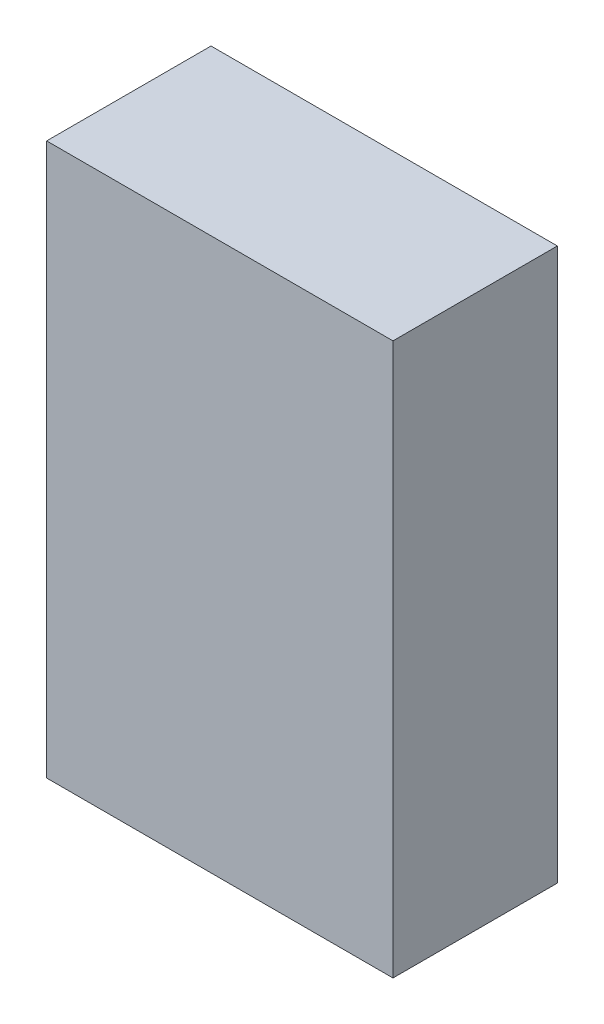
ISO-10303-21;
HEADER;
FILE_DESCRIPTION(('STEP AP214'),'2;1');
FILE_NAME('part.step','',(''),(''),'','','');
FILE_SCHEMA(('AUTOMOTIVE_DESIGN { 1 0 10303 214 1 1 1 1 }'));
ENDSEC;
DATA;
#1=APPLICATION_CONTEXT('core data for automotive mechanical design processes');
#2=APPLICATION_PROTOCOL_DEFINITION('international standard','automotive_design',2000,#1);
#3=PRODUCT_CONTEXT('',#1,'mechanical');
#4=PRODUCT('Part','Part','',(#3));
#5=PRODUCT_RELATED_PRODUCT_CATEGORY('part','',(#4));
#6=PRODUCT_DEFINITION_FORMATION('','',#4);
#7=PRODUCT_DEFINITION_CONTEXT('part definition',#1,'design');
#8=PRODUCT_DEFINITION('design','',#6,#7);
#9=PRODUCT_DEFINITION_SHAPE('','',#8);
#10=(LENGTH_UNIT() NAMED_UNIT(*) SI_UNIT(.MILLI.,.METRE.));
#11=(NAMED_UNIT(*) PLANE_ANGLE_UNIT() SI_UNIT($,.RADIAN.));
#12=(NAMED_UNIT(*) SI_UNIT($,.STERADIAN.) SOLID_ANGLE_UNIT());
#13=UNCERTAINTY_MEASURE_WITH_UNIT(LENGTH_MEASURE(1.E-05),#10,'distance_accuracy_value','');
#14=(GEOMETRIC_REPRESENTATION_CONTEXT(3) GLOBAL_UNCERTAINTY_ASSIGNED_CONTEXT((#13)) GLOBAL_UNIT_ASSIGNED_CONTEXT((#10,
#11,#12)) REPRESENTATION_CONTEXT('',''));
#15=CARTESIAN_POINT('',(0.,0.,0.));
#16=DIRECTION('',(0.,0.,1.));
#17=DIRECTION('',(1.,0.,0.));
#18=AXIS2_PLACEMENT_3D('',#15,#16,#17);
#19=CARTESIAN_POINT('',(0.,0.,0.));
#20=DIRECTION('',(0.,0.,1.));
#21=DIRECTION('',(1.,0.,0.));
#22=AXIS2_PLACEMENT_3D('',#19,#20,#21);
#23=PLANE('',#22);
#24=DIRECTION('',(0.,-1.,0.));
#25=VECTOR('',#24,1.);
#26=CARTESIAN_POINT('',(51.4055000000001,-19.39,0.));
#27=LINE('',#26,#25);
#28=CARTESIAN_POINT('',(51.4055000000001,-17.39,0.));
#29=VERTEX_POINT('',#28);
#30=CARTESIAN_POINT('',(51.4055000000001,-111.39,0.));
#31=VERTEX_POINT('',#30);
#32=EDGE_CURVE('E204',#29,#31,#27,.T.);
#33=ORIENTED_EDGE('',*,*,#32,.F.);
#34=DIRECTION('',(-1.,0.,0.));
#35=VECTOR('',#34,1.);
#36=CARTESIAN_POINT('',(53.4055000000001,-17.39,0.));
#37=LINE('',#36,#35);
#38=CARTESIAN_POINT('',(110.4055,-17.39,0.));
#39=VERTEX_POINT('',#38);
#40=EDGE_CURVE('E138',#39,#29,#37,.T.);
#41=ORIENTED_EDGE('',*,*,#40,.F.);
#42=DIRECTION('',(0.,1.,0.));
#43=VECTOR('',#42,1.);
#44=CARTESIAN_POINT('',(110.4055,-19.39,0.));
#45=LINE('',#44,#43);
#46=CARTESIAN_POINT('',(110.4055,-111.39,0.));
#47=VERTEX_POINT('',#46);
#48=EDGE_CURVE('E210',#47,#39,#45,.T.);
#49=ORIENTED_EDGE('',*,*,#48,.F.);
#50=DIRECTION('',(1.,0.,0.));
#51=VECTOR('',#50,1.);
#52=CARTESIAN_POINT('',(53.4055000000001,-111.39,0.));
#53=LINE('',#52,#51);
#54=EDGE_CURVE('E207',#31,#47,#53,.T.);
#55=ORIENTED_EDGE('',*,*,#54,.F.);
#56=EDGE_LOOP('',(#33,#41,#49,#55));
#57=FACE_BOUND('',#56,.T.);
#58=DIRECTION('',(0.,-1.,0.));
#59=VECTOR('',#58,1.);
#60=CARTESIAN_POINT('',(53.4055000000001,-19.39,0.));
#61=LINE('',#60,#59);
#62=CARTESIAN_POINT('',(53.4055000000001,-19.39,0.));
#63=VERTEX_POINT('',#62);
#64=CARTESIAN_POINT('',(53.4055000000001,-109.39,0.));
#65=VERTEX_POINT('',#64);
#66=EDGE_CURVE('E87',#63,#65,#61,.T.);
#67=ORIENTED_EDGE('',*,*,#66,.T.);
#68=DIRECTION('',(1.,0.,0.));
#69=VECTOR('',#68,1.);
#70=CARTESIAN_POINT('',(53.4055000000001,-109.39,0.));
#71=LINE('',#70,#69);
#72=CARTESIAN_POINT('',(108.4055,-109.39,0.));
#73=VERTEX_POINT('',#72);
#74=EDGE_CURVE('E182',#65,#73,#71,.T.);
#75=ORIENTED_EDGE('',*,*,#74,.T.);
#76=DIRECTION('',(0.,1.,0.));
#77=VECTOR('',#76,1.);
#78=CARTESIAN_POINT('',(108.4055,-19.39,0.));
#79=LINE('',#78,#77);
#80=CARTESIAN_POINT('',(108.4055,-19.39,0.));
#81=VERTEX_POINT('',#80);
#82=EDGE_CURVE('E186',#73,#81,#79,.T.);
#83=ORIENTED_EDGE('',*,*,#82,.T.);
#84=DIRECTION('',(-1.,0.,0.));
#85=VECTOR('',#84,1.);
#86=CARTESIAN_POINT('',(53.4055000000001,-19.39,0.));
#87=LINE('',#86,#85);
#88=EDGE_CURVE('E169',#81,#63,#87,.T.);
#89=ORIENTED_EDGE('',*,*,#88,.T.);
#90=EDGE_LOOP('',(#67,#75,#83,#89));
#91=FACE_BOUND('',#90,.T.);
#92=ADVANCED_FACE('F63',(#57,#91),#23,.F.);
#93=CARTESIAN_POINT('',(51.4055000000001,-19.39,26.));
#94=DIRECTION('',(1.,0.,0.));
#95=DIRECTION('',(0.,1.,0.));
#96=AXIS2_PLACEMENT_3D('',#93,#94,#95);
#97=PLANE('',#96);
#98=ORIENTED_EDGE('',*,*,#32,.T.);
#99=DIRECTION('',(0.,0.,-1.));
#100=VECTOR('',#99,1.);
#101=CARTESIAN_POINT('',(51.4055000000001,-111.39,26.));
#102=LINE('',#101,#100);
#103=CARTESIAN_POINT('',(51.4055000000001,-111.39,28.));
#104=VERTEX_POINT('',#103);
#105=EDGE_CURVE('E12',#104,#31,#102,.T.);
#106=ORIENTED_EDGE('',*,*,#105,.F.);
#107=DIRECTION('',(0.,-1.,0.));
#108=VECTOR('',#107,1.);
#109=CARTESIAN_POINT('',(51.4055000000001,-17.39,28.));
#110=LINE('',#109,#108);
#111=CARTESIAN_POINT('',(51.4055000000001,-17.39,28.));
#112=VERTEX_POINT('',#111);
#113=EDGE_CURVE('E146',#112,#104,#110,.T.);
#114=ORIENTED_EDGE('',*,*,#113,.F.);
#115=DIRECTION('',(0.,0.,-1.));
#116=VECTOR('',#115,1.);
#117=CARTESIAN_POINT('',(51.4055000000001,-17.39,26.));
#118=LINE('',#117,#116);
#119=EDGE_CURVE('E131',#112,#29,#118,.T.);
#120=ORIENTED_EDGE('',*,*,#119,.T.);
#121=EDGE_LOOP('',(#98,#106,#114,#120));
#122=FACE_BOUND('',#121,.T.);
#123=ADVANCED_FACE('F65',(#122),#97,.F.);
#124=CARTESIAN_POINT('',(53.4055000000001,-111.39,26.));
#125=DIRECTION('',(0.,1.,0.));
#126=DIRECTION('',(0.,0.,1.));
#127=AXIS2_PLACEMENT_3D('',#124,#125,#126);
#128=PLANE('',#127);
#129=ORIENTED_EDGE('',*,*,#54,.T.);
#130=DIRECTION('',(0.,0.,-1.));
#131=VECTOR('',#130,1.);
#132=CARTESIAN_POINT('',(110.4055,-111.39,26.));
#133=LINE('',#132,#131);
#134=CARTESIAN_POINT('',(110.4055,-111.39,28.));
#135=VERTEX_POINT('',#134);
#136=EDGE_CURVE('E72',#135,#47,#133,.T.);
#137=ORIENTED_EDGE('',*,*,#136,.F.);
#138=DIRECTION('',(1.,0.,0.));
#139=VECTOR('',#138,1.);
#140=CARTESIAN_POINT('',(51.4055000000001,-111.39,28.));
#141=LINE('',#140,#139);
#142=EDGE_CURVE('E151',#104,#135,#141,.T.);
#143=ORIENTED_EDGE('',*,*,#142,.F.);
#144=ORIENTED_EDGE('',*,*,#105,.T.);
#145=EDGE_LOOP('',(#129,#137,#143,#144));
#146=FACE_BOUND('',#145,.T.);
#147=ADVANCED_FACE('F224',(#146),#128,.F.);
#148=CARTESIAN_POINT('',(110.4055,-19.39,26.));
#149=DIRECTION('',(-1.,0.,0.));
#150=DIRECTION('',(0.,-1.,0.));
#151=AXIS2_PLACEMENT_3D('',#148,#149,#150);
#152=PLANE('',#151);
#153=ORIENTED_EDGE('',*,*,#48,.T.);
#154=DIRECTION('',(0.,0.,-1.));
#155=VECTOR('',#154,1.);
#156=CARTESIAN_POINT('',(110.4055,-17.39,26.));
#157=LINE('',#156,#155);
#158=CARTESIAN_POINT('',(110.4055,-17.39,28.));
#159=VERTEX_POINT('',#158);
#160=EDGE_CURVE('E143',#159,#39,#157,.T.);
#161=ORIENTED_EDGE('',*,*,#160,.F.);
#162=DIRECTION('',(0.,1.,0.));
#163=VECTOR('',#162,1.);
#164=CARTESIAN_POINT('',(110.4055,-111.39,28.));
#165=LINE('',#164,#163);
#166=EDGE_CURVE('E156',#135,#159,#165,.T.);
#167=ORIENTED_EDGE('',*,*,#166,.F.);
#168=ORIENTED_EDGE('',*,*,#136,.T.);
#169=EDGE_LOOP('',(#153,#161,#167,#168));
#170=FACE_BOUND('',#169,.T.);
#171=ADVANCED_FACE('F220',(#170),#152,.F.);
#172=CARTESIAN_POINT('',(53.4055000000001,-17.39,26.));
#173=DIRECTION('',(0.,-1.,0.));
#174=DIRECTION('',(0.,0.,-1.));
#175=AXIS2_PLACEMENT_3D('',#172,#173,#174);
#176=PLANE('',#175);
#177=ORIENTED_EDGE('',*,*,#40,.T.);
#178=ORIENTED_EDGE('',*,*,#119,.F.);
#179=DIRECTION('',(-1.,0.,0.));
#180=VECTOR('',#179,1.);
#181=CARTESIAN_POINT('',(110.4055,-17.39,28.));
#182=LINE('',#181,#180);
#183=EDGE_CURVE('E136',#159,#112,#182,.T.);
#184=ORIENTED_EDGE('',*,*,#183,.F.);
#185=ORIENTED_EDGE('',*,*,#160,.T.);
#186=EDGE_LOOP('',(#177,#178,#184,#185));
#187=FACE_BOUND('',#186,.T.);
#188=ADVANCED_FACE('F133',(#187),#176,.F.);
#189=CARTESIAN_POINT('',(53.4055000000001,-19.39,26.));
#190=DIRECTION('',(1.,0.,0.));
#191=DIRECTION('',(0.,1.,0.));
#192=AXIS2_PLACEMENT_3D('',#189,#190,#191);
#193=PLANE('',#192);
#194=ORIENTED_EDGE('',*,*,#66,.F.);
#195=DIRECTION('',(0.,0.,-1.));
#196=VECTOR('',#195,1.);
#197=CARTESIAN_POINT('',(53.4055000000001,-19.39,26.));
#198=LINE('',#197,#196);
#199=CARTESIAN_POINT('',(53.4055000000001,-19.39,26.));
#200=VERTEX_POINT('',#199);
#201=EDGE_CURVE('E179',#200,#63,#198,.T.);
#202=ORIENTED_EDGE('',*,*,#201,.F.);
#203=DIRECTION('',(0.,-1.,0.));
#204=VECTOR('',#203,1.);
#205=CARTESIAN_POINT('',(53.4055000000001,-19.39,26.));
#206=LINE('',#205,#204);
#207=CARTESIAN_POINT('',(53.4055000000001,-109.39,26.));
#208=VERTEX_POINT('',#207);
#209=EDGE_CURVE('E164',#200,#208,#206,.T.);
#210=ORIENTED_EDGE('',*,*,#209,.T.);
#211=DIRECTION('',(0.,0.,-1.));
#212=VECTOR('',#211,1.);
#213=CARTESIAN_POINT('',(53.4055000000001,-109.39,26.));
#214=LINE('',#213,#212);
#215=EDGE_CURVE('E201',#208,#65,#214,.T.);
#216=ORIENTED_EDGE('',*,*,#215,.T.);
#217=EDGE_LOOP('',(#194,#202,#210,#216));
#218=FACE_BOUND('',#217,.T.);
#219=ADVANCED_FACE('F237',(#218),#193,.T.);
#220=CARTESIAN_POINT('',(53.4055000000001,-109.39,26.));
#221=DIRECTION('',(0.,1.,0.));
#222=DIRECTION('',(0.,0.,1.));
#223=AXIS2_PLACEMENT_3D('',#220,#221,#222);
#224=PLANE('',#223);
#225=ORIENTED_EDGE('',*,*,#74,.F.);
#226=ORIENTED_EDGE('',*,*,#215,.F.);
#227=DIRECTION('',(1.,0.,0.));
#228=VECTOR('',#227,1.);
#229=CARTESIAN_POINT('',(53.4055000000001,-109.39,26.));
#230=LINE('',#229,#228);
#231=CARTESIAN_POINT('',(108.4055,-109.39,26.));
#232=VERTEX_POINT('',#231);
#233=EDGE_CURVE('E168',#208,#232,#230,.T.);
#234=ORIENTED_EDGE('',*,*,#233,.T.);
#235=DIRECTION('',(0.,0.,-1.));
#236=VECTOR('',#235,1.);
#237=CARTESIAN_POINT('',(108.4055,-109.39,26.));
#238=LINE('',#237,#236);
#239=EDGE_CURVE('E198',#232,#73,#238,.T.);
#240=ORIENTED_EDGE('',*,*,#239,.T.);
#241=EDGE_LOOP('',(#225,#226,#234,#240));
#242=FACE_BOUND('',#241,.T.);
#243=ADVANCED_FACE('F243',(#242),#224,.T.);
#244=CARTESIAN_POINT('',(108.4055,-19.39,26.));
#245=DIRECTION('',(-1.,0.,0.));
#246=DIRECTION('',(0.,-1.,0.));
#247=AXIS2_PLACEMENT_3D('',#244,#245,#246);
#248=PLANE('',#247);
#249=ORIENTED_EDGE('',*,*,#82,.F.);
#250=ORIENTED_EDGE('',*,*,#239,.F.);
#251=DIRECTION('',(0.,1.,0.));
#252=VECTOR('',#251,1.);
#253=CARTESIAN_POINT('',(108.4055,-19.39,26.));
#254=LINE('',#253,#252);
#255=CARTESIAN_POINT('',(108.4055,-19.39,26.));
#256=VERTEX_POINT('',#255);
#257=EDGE_CURVE('E173',#232,#256,#254,.T.);
#258=ORIENTED_EDGE('',*,*,#257,.T.);
#259=DIRECTION('',(0.,0.,-1.));
#260=VECTOR('',#259,1.);
#261=CARTESIAN_POINT('',(108.4055,-19.39,26.));
#262=LINE('',#261,#260);
#263=EDGE_CURVE('E195',#256,#81,#262,.T.);
#264=ORIENTED_EDGE('',*,*,#263,.T.);
#265=EDGE_LOOP('',(#249,#250,#258,#264));
#266=FACE_BOUND('',#265,.T.);
#267=ADVANCED_FACE('F247',(#266),#248,.T.);
#268=CARTESIAN_POINT('',(53.4055000000001,-19.39,26.));
#269=DIRECTION('',(0.,-1.,0.));
#270=DIRECTION('',(0.,0.,-1.));
#271=AXIS2_PLACEMENT_3D('',#268,#269,#270);
#272=PLANE('',#271);
#273=ORIENTED_EDGE('',*,*,#88,.F.);
#274=ORIENTED_EDGE('',*,*,#263,.F.);
#275=DIRECTION('',(-1.,0.,0.));
#276=VECTOR('',#275,1.);
#277=CARTESIAN_POINT('',(53.4055000000001,-19.39,26.));
#278=LINE('',#277,#276);
#279=EDGE_CURVE('E79',#256,#200,#278,.T.);
#280=ORIENTED_EDGE('',*,*,#279,.T.);
#281=ORIENTED_EDGE('',*,*,#201,.T.);
#282=EDGE_LOOP('',(#273,#274,#280,#281));
#283=FACE_BOUND('',#282,.T.);
#284=ADVANCED_FACE('F252',(#283),#272,.T.);
#285=CARTESIAN_POINT('',(0.,0.,26.));
#286=DIRECTION('',(0.,0.,1.));
#287=DIRECTION('',(1.,0.,0.));
#288=AXIS2_PLACEMENT_3D('',#285,#286,#287);
#289=PLANE('',#288);
#290=ORIENTED_EDGE('',*,*,#233,.F.);
#291=ORIENTED_EDGE('',*,*,#209,.F.);
#292=ORIENTED_EDGE('',*,*,#279,.F.);
#293=ORIENTED_EDGE('',*,*,#257,.F.);
#294=EDGE_LOOP('',(#290,#291,#292,#293));
#295=FACE_BOUND('',#294,.T.);
#296=ADVANCED_FACE('F258',(#295),#289,.F.);
#297=CARTESIAN_POINT('',(0.,0.,28.));
#298=DIRECTION('',(0.,0.,1.));
#299=DIRECTION('',(1.,0.,0.));
#300=AXIS2_PLACEMENT_3D('',#297,#298,#299);
#301=PLANE('',#300);
#302=ORIENTED_EDGE('',*,*,#183,.T.);
#303=ORIENTED_EDGE('',*,*,#113,.T.);
#304=ORIENTED_EDGE('',*,*,#142,.T.);
#305=ORIENTED_EDGE('',*,*,#166,.T.);
#306=EDGE_LOOP('',(#302,#303,#304,#305));
#307=FACE_BOUND('',#306,.T.);
#308=ADVANCED_FACE('F154',(#307),#301,.T.);
#309=CLOSED_SHELL('',(#92,#123,#147,#171,#188,#219,#243,#267,#284,#296,#308));
#310=MANIFOLD_SOLID_BREP('B2',#309);
#311=ADVANCED_BREP_SHAPE_REPRESENTATION('',(#18,#310),#14);
#312=SHAPE_DEFINITION_REPRESENTATION(#9,#311);
ENDSEC;
END-ISO-10303-21;
